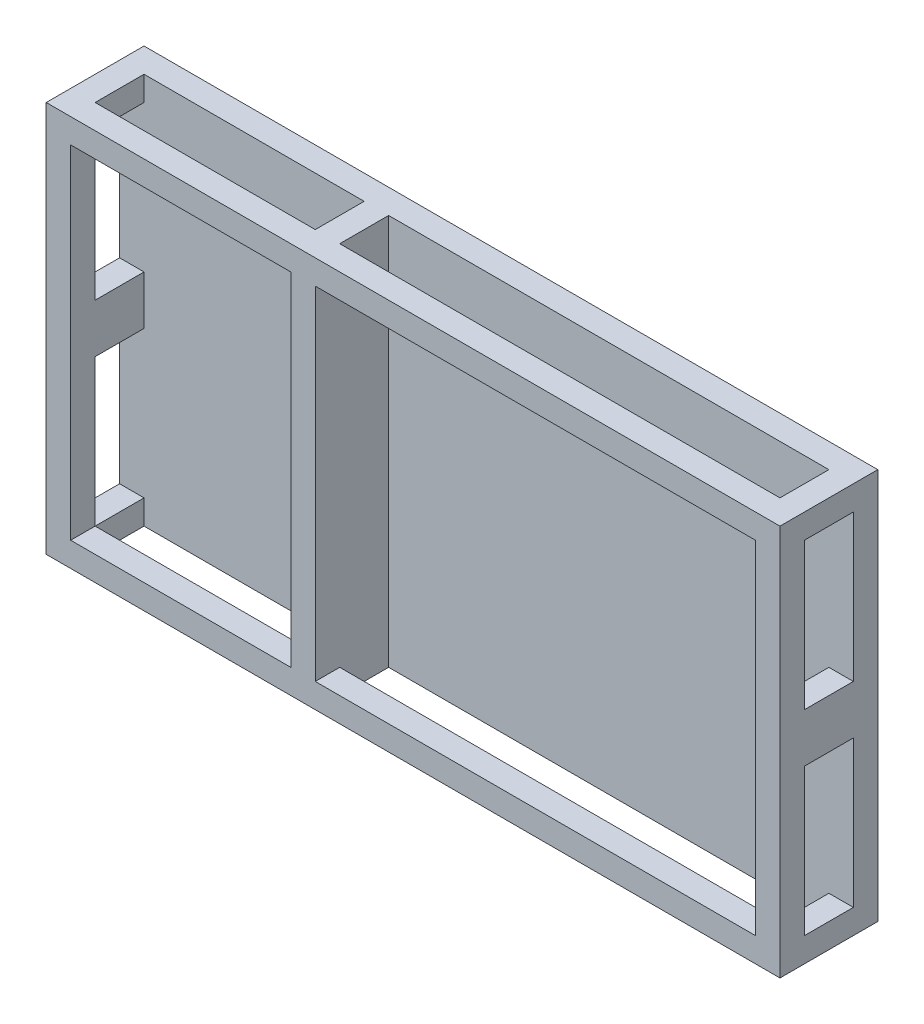
ISO-10303-21;
HEADER;
FILE_DESCRIPTION(('STEP AP214'),'2;1');
FILE_NAME('part.step','',(''),(''),'','','');
FILE_SCHEMA(('AUTOMOTIVE_DESIGN { 1 0 10303 214 1 1 1 1 }'));
ENDSEC;
DATA;
#1=APPLICATION_CONTEXT('core data for automotive mechanical design processes');
#2=APPLICATION_PROTOCOL_DEFINITION('international standard','automotive_design',2000,#1);
#3=PRODUCT_CONTEXT('',#1,'mechanical');
#4=PRODUCT('Part','Part','',(#3));
#5=PRODUCT_RELATED_PRODUCT_CATEGORY('part','',(#4));
#6=PRODUCT_DEFINITION_FORMATION('','',#4);
#7=PRODUCT_DEFINITION_CONTEXT('part definition',#1,'design');
#8=PRODUCT_DEFINITION('design','',#6,#7);
#9=PRODUCT_DEFINITION_SHAPE('','',#8);
#10=(LENGTH_UNIT() NAMED_UNIT(*) SI_UNIT(.MILLI.,.METRE.));
#11=(NAMED_UNIT(*) PLANE_ANGLE_UNIT() SI_UNIT($,.RADIAN.));
#12=(NAMED_UNIT(*) SI_UNIT($,.STERADIAN.) SOLID_ANGLE_UNIT());
#13=UNCERTAINTY_MEASURE_WITH_UNIT(LENGTH_MEASURE(1.E-05),#10,'distance_accuracy_value','');
#14=(GEOMETRIC_REPRESENTATION_CONTEXT(3) GLOBAL_UNCERTAINTY_ASSIGNED_CONTEXT((#13)) GLOBAL_UNIT_ASSIGNED_CONTEXT((#10,
#11,#12)) REPRESENTATION_CONTEXT('',''));
#15=CARTESIAN_POINT('',(0.,0.,0.));
#16=DIRECTION('',(0.,0.,1.));
#17=DIRECTION('',(1.,0.,0.));
#18=AXIS2_PLACEMENT_3D('',#15,#16,#17);
#19=CARTESIAN_POINT('',(5.,0.,15.));
#20=DIRECTION('',(0.,0.,1.));
#21=DIRECTION('',(1.,0.,0.));
#22=AXIS2_PLACEMENT_3D('',#19,#20,#21);
#23=PLANE('',#22);
#24=DIRECTION('',(0.,1.,0.));
#25=VECTOR('',#24,1.);
#26=CARTESIAN_POINT('',(150.,75.,15.));
#27=LINE('',#26,#25);
#28=CARTESIAN_POINT('',(150.,45.,15.));
#29=VERTEX_POINT('',#28);
#30=CARTESIAN_POINT('',(150.,75.,15.));
#31=VERTEX_POINT('',#30);
#32=EDGE_CURVE('E280',#29,#31,#27,.T.);
#33=ORIENTED_EDGE('',*,*,#32,.F.);
#34=DIRECTION('',(-1.,0.,0.));
#35=VECTOR('',#34,1.);
#36=CARTESIAN_POINT('',(5.,45.,15.));
#37=LINE('',#36,#35);
#38=CARTESIAN_POINT('',(145.,45.,15.));
#39=VERTEX_POINT('',#38);
#40=EDGE_CURVE('E640',#29,#39,#37,.T.);
#41=ORIENTED_EDGE('',*,*,#40,.T.);
#42=DIRECTION('',(0.,1.,0.));
#43=VECTOR('',#42,1.);
#44=CARTESIAN_POINT('',(145.,0.,15.));
#45=LINE('',#44,#43);
#46=CARTESIAN_POINT('',(145.,75.,15.));
#47=VERTEX_POINT('',#46);
#48=EDGE_CURVE('E469',#39,#47,#45,.T.);
#49=ORIENTED_EDGE('',*,*,#48,.T.);
#50=DIRECTION('',(-1.,0.,0.));
#51=VECTOR('',#50,1.);
#52=CARTESIAN_POINT('',(150.,75.,15.));
#53=LINE('',#52,#51);
#54=EDGE_CURVE('E306',#31,#47,#53,.T.);
#55=ORIENTED_EDGE('',*,*,#54,.F.);
#56=EDGE_LOOP('',(#33,#41,#49,#55));
#57=FACE_BOUND('',#56,.T.);
#58=ADVANCED_FACE('F37',(#57),#23,.F.);
#59=DIRECTION('',(0.,-1.,0.));
#60=VECTOR('',#59,1.);
#61=CARTESIAN_POINT('',(5.,0.,15.));
#62=LINE('',#61,#60);
#63=CARTESIAN_POINT('',(5.,75.,15.));
#64=VERTEX_POINT('',#63);
#65=CARTESIAN_POINT('',(4.99999999999999,45.,15.));
#66=VERTEX_POINT('',#65);
#67=EDGE_CURVE('E467',#64,#66,#62,.T.);
#68=ORIENTED_EDGE('',*,*,#67,.T.);
#69=DIRECTION('',(-1.,0.,0.));
#70=VECTOR('',#69,1.);
#71=CARTESIAN_POINT('',(5.,45.,15.));
#72=LINE('',#71,#70);
#73=CARTESIAN_POINT('',(0.,45.,15.));
#74=VERTEX_POINT('',#73);
#75=EDGE_CURVE('E622',#66,#74,#72,.T.);
#76=ORIENTED_EDGE('',*,*,#75,.T.);
#77=DIRECTION('',(0.,1.,0.));
#78=VECTOR('',#77,1.);
#79=CARTESIAN_POINT('',(0.,75.,15.));
#80=LINE('',#79,#78);
#81=CARTESIAN_POINT('',(0.,75.,15.));
#82=VERTEX_POINT('',#81);
#83=EDGE_CURVE('E294',#74,#82,#80,.T.);
#84=ORIENTED_EDGE('',*,*,#83,.T.);
#85=EDGE_CURVE('E309',#64,#82,#53,.T.);
#86=ORIENTED_EDGE('',*,*,#85,.F.);
#87=EDGE_LOOP('',(#68,#76,#84,#86));
#88=FACE_BOUND('',#87,.T.);
#89=ADVANCED_FACE('F559',(#88),#23,.F.);
#90=DIRECTION('',(1.,0.,0.));
#91=VECTOR('',#90,1.);
#92=CARTESIAN_POINT('',(5.,80.,15.));
#93=LINE('',#92,#91);
#94=CARTESIAN_POINT('',(5.,80.,15.));
#95=VERTEX_POINT('',#94);
#96=CARTESIAN_POINT('',(50.,80.,15.));
#97=VERTEX_POINT('',#96);
#98=EDGE_CURVE('E346',#95,#97,#93,.T.);
#99=ORIENTED_EDGE('',*,*,#98,.T.);
#100=DIRECTION('',(0.,-1.,0.));
#101=VECTOR('',#100,1.);
#102=CARTESIAN_POINT('',(50.,0.,15.));
#103=LINE('',#102,#101);
#104=CARTESIAN_POINT('',(50.,75.,15.));
#105=VERTEX_POINT('',#104);
#106=EDGE_CURVE('E422',#97,#105,#103,.T.);
#107=ORIENTED_EDGE('',*,*,#106,.T.);
#108=DIRECTION('',(-1.,0.,0.));
#109=VECTOR('',#108,1.);
#110=CARTESIAN_POINT('',(5.,75.,15.));
#111=LINE('',#110,#109);
#112=EDGE_CURVE('E401',#105,#64,#111,.T.);
#113=ORIENTED_EDGE('',*,*,#112,.T.);
#114=DIRECTION('',(0.,1.,0.));
#115=VECTOR('',#114,1.);
#116=CARTESIAN_POINT('',(5.,0.,15.));
#117=LINE('',#116,#115);
#118=EDGE_CURVE('E342',#64,#95,#117,.T.);
#119=ORIENTED_EDGE('',*,*,#118,.T.);
#120=EDGE_LOOP('',(#99,#107,#113,#119));
#121=FACE_BOUND('',#120,.T.);
#122=ADVANCED_FACE('F565',(#121),#23,.F.);
#123=DIRECTION('',(1.,0.,0.));
#124=VECTOR('',#123,1.);
#125=CARTESIAN_POINT('',(5.,4.99999999999999,15.));
#126=LINE('',#125,#124);
#127=CARTESIAN_POINT('',(5.,4.99999999999999,15.));
#128=VERTEX_POINT('',#127);
#129=CARTESIAN_POINT('',(50.,4.99999999999999,15.));
#130=VERTEX_POINT('',#129);
#131=EDGE_CURVE('E45',#128,#130,#126,.T.);
#132=ORIENTED_EDGE('',*,*,#131,.T.);
#133=CARTESIAN_POINT('',(50.,0.,15.));
#134=VERTEX_POINT('',#133);
#135=EDGE_CURVE('E409',#130,#134,#103,.T.);
#136=ORIENTED_EDGE('',*,*,#135,.T.);
#137=DIRECTION('',(1.,0.,0.));
#138=VECTOR('',#137,1.);
#139=CARTESIAN_POINT('',(5.,0.,15.));
#140=LINE('',#139,#138);
#141=CARTESIAN_POINT('',(5.,0.,15.));
#142=VERTEX_POINT('',#141);
#143=EDGE_CURVE('E332',#142,#134,#140,.T.);
#144=ORIENTED_EDGE('',*,*,#143,.F.);
#145=EDGE_CURVE('E366',#142,#128,#117,.T.);
#146=ORIENTED_EDGE('',*,*,#145,.T.);
#147=EDGE_LOOP('',(#132,#136,#144,#146));
#148=FACE_BOUND('',#147,.T.);
#149=ADVANCED_FACE('F407',(#148),#23,.F.);
#150=CARTESIAN_POINT('',(55.002119461006,0.,15.));
#151=VERTEX_POINT('',#150);
#152=CARTESIAN_POINT('',(145.,0.,15.));
#153=VERTEX_POINT('',#152);
#154=EDGE_CURVE('E330',#151,#153,#140,.T.);
#155=ORIENTED_EDGE('',*,*,#154,.F.);
#156=DIRECTION('',(0.,1.,0.));
#157=VECTOR('',#156,1.);
#158=CARTESIAN_POINT('',(55.002119461006,0.,15.));
#159=LINE('',#158,#157);
#160=CARTESIAN_POINT('',(55.002119461006,4.99999999999999,15.));
#161=VERTEX_POINT('',#160);
#162=EDGE_CURVE('E434',#151,#161,#159,.T.);
#163=ORIENTED_EDGE('',*,*,#162,.T.);
#164=DIRECTION('',(1.,0.,0.));
#165=VECTOR('',#164,1.);
#166=CARTESIAN_POINT('',(5.,4.99999999999999,15.));
#167=LINE('',#166,#165);
#168=CARTESIAN_POINT('',(145.,4.99999999999999,15.));
#169=VERTEX_POINT('',#168);
#170=EDGE_CURVE('E399',#161,#169,#167,.T.);
#171=ORIENTED_EDGE('',*,*,#170,.T.);
#172=DIRECTION('',(0.,1.,0.));
#173=VECTOR('',#172,1.);
#174=CARTESIAN_POINT('',(145.,0.,15.));
#175=LINE('',#174,#173);
#176=EDGE_CURVE('E362',#153,#169,#175,.T.);
#177=ORIENTED_EDGE('',*,*,#176,.F.);
#178=EDGE_LOOP('',(#155,#163,#171,#177));
#179=FACE_BOUND('',#178,.T.);
#180=ADVANCED_FACE('F485',(#179),#23,.F.);
#181=CARTESIAN_POINT('',(5.,0.,5.));
#182=DIRECTION('',(0.,0.,-1.));
#183=DIRECTION('',(-1.,0.,0.));
#184=AXIS2_PLACEMENT_3D('',#181,#182,#183);
#185=PLANE('',#184);
#186=DIRECTION('',(0.,-1.,0.));
#187=VECTOR('',#186,1.);
#188=CARTESIAN_POINT('',(0.,75.,5.));
#189=LINE('',#188,#187);
#190=CARTESIAN_POINT('',(0.,75.,5.));
#191=VERTEX_POINT('',#190);
#192=CARTESIAN_POINT('',(0.,45.,5.));
#193=VERTEX_POINT('',#192);
#194=EDGE_CURVE('E288',#191,#193,#189,.T.);
#195=ORIENTED_EDGE('',*,*,#194,.T.);
#196=DIRECTION('',(1.,0.,0.));
#197=VECTOR('',#196,1.);
#198=CARTESIAN_POINT('',(5.,45.,5.));
#199=LINE('',#198,#197);
#200=CARTESIAN_POINT('',(5.,45.,5.));
#201=VERTEX_POINT('',#200);
#202=EDGE_CURVE('E625',#193,#201,#199,.T.);
#203=ORIENTED_EDGE('',*,*,#202,.T.);
#204=DIRECTION('',(0.,1.,0.));
#205=VECTOR('',#204,1.);
#206=CARTESIAN_POINT('',(5.,0.,5.));
#207=LINE('',#206,#205);
#208=CARTESIAN_POINT('',(5.,35.,5.));
#209=VERTEX_POINT('',#208);
#210=EDGE_CURVE('E517',#209,#201,#207,.T.);
#211=ORIENTED_EDGE('',*,*,#210,.F.);
#212=DIRECTION('',(-1.,0.,0.));
#213=VECTOR('',#212,1.);
#214=CARTESIAN_POINT('',(5.,35.,5.));
#215=LINE('',#214,#213);
#216=CARTESIAN_POINT('',(0.,35.,5.));
#217=VERTEX_POINT('',#216);
#218=EDGE_CURVE('E607',#209,#217,#215,.T.);
#219=ORIENTED_EDGE('',*,*,#218,.T.);
#220=CARTESIAN_POINT('',(0.,4.99999999999999,5.00000000000001));
#221=VERTEX_POINT('',#220);
#222=EDGE_CURVE('E291',#217,#221,#189,.T.);
#223=ORIENTED_EDGE('',*,*,#222,.T.);
#224=DIRECTION('',(-1.,0.,0.));
#225=VECTOR('',#224,1.);
#226=CARTESIAN_POINT('',(150.,4.99999999999999,5.00000000000001));
#227=LINE('',#226,#225);
#228=CARTESIAN_POINT('',(5.,4.99999999999999,5.00000000000001));
#229=VERTEX_POINT('',#228);
#230=EDGE_CURVE('E283',#229,#221,#227,.T.);
#231=ORIENTED_EDGE('',*,*,#230,.F.);
#232=DIRECTION('',(0.,1.,0.));
#233=VECTOR('',#232,1.);
#234=CARTESIAN_POINT('',(5.,0.,5.));
#235=LINE('',#234,#233);
#236=CARTESIAN_POINT('',(5.,0.,5.));
#237=VERTEX_POINT('',#236);
#238=EDGE_CURVE('E353',#237,#229,#235,.T.);
#239=ORIENTED_EDGE('',*,*,#238,.F.);
#240=DIRECTION('',(-1.,0.,0.));
#241=VECTOR('',#240,1.);
#242=CARTESIAN_POINT('',(5.,0.,5.));
#243=LINE('',#242,#241);
#244=CARTESIAN_POINT('',(50.,0.,5.));
#245=VERTEX_POINT('',#244);
#246=EDGE_CURVE('E338',#245,#237,#243,.T.);
#247=ORIENTED_EDGE('',*,*,#246,.F.);
#248=DIRECTION('',(0.,1.,0.));
#249=VECTOR('',#248,1.);
#250=CARTESIAN_POINT('',(50.,0.,5.));
#251=LINE('',#250,#249);
#252=CARTESIAN_POINT('',(50.,80.,5.));
#253=VERTEX_POINT('',#252);
#254=EDGE_CURVE('E423',#245,#253,#251,.T.);
#255=ORIENTED_EDGE('',*,*,#254,.T.);
#256=DIRECTION('',(-1.,0.,0.));
#257=VECTOR('',#256,1.);
#258=CARTESIAN_POINT('',(5.,80.,5.));
#259=LINE('',#258,#257);
#260=CARTESIAN_POINT('',(5.,80.,5.));
#261=VERTEX_POINT('',#260);
#262=EDGE_CURVE('E351',#253,#261,#259,.T.);
#263=ORIENTED_EDGE('',*,*,#262,.T.);
#264=CARTESIAN_POINT('',(5.,75.,5.));
#265=VERTEX_POINT('',#264);
#266=EDGE_CURVE('E357',#265,#261,#235,.T.);
#267=ORIENTED_EDGE('',*,*,#266,.F.);
#268=DIRECTION('',(-1.,0.,0.));
#269=VECTOR('',#268,1.);
#270=CARTESIAN_POINT('',(150.,75.,5.));
#271=LINE('',#270,#269);
#272=EDGE_CURVE('E305',#265,#191,#271,.T.);
#273=ORIENTED_EDGE('',*,*,#272,.T.);
#274=EDGE_LOOP('',(#195,#203,#211,#219,#223,#231,#239,#247,#255,#263,#267,#273));
#275=FACE_BOUND('',#274,.T.);
#276=ADVANCED_FACE('F590',(#275),#185,.F.);
#277=DIRECTION('',(-1.,0.,0.));
#278=VECTOR('',#277,1.);
#279=CARTESIAN_POINT('',(5.,75.,15.));
#280=LINE('',#279,#278);
#281=CARTESIAN_POINT('',(55.002119461006,75.,15.));
#282=VERTEX_POINT('',#281);
#283=EDGE_CURVE('E396',#47,#282,#280,.T.);
#284=ORIENTED_EDGE('',*,*,#283,.T.);
#285=CARTESIAN_POINT('',(55.002119461006,80.,15.));
#286=VERTEX_POINT('',#285);
#287=EDGE_CURVE('E425',#282,#286,#159,.T.);
#288=ORIENTED_EDGE('',*,*,#287,.T.);
#289=CARTESIAN_POINT('',(145.,80.,15.));
#290=VERTEX_POINT('',#289);
#291=EDGE_CURVE('E345',#286,#290,#93,.T.);
#292=ORIENTED_EDGE('',*,*,#291,.T.);
#293=EDGE_CURVE('E365',#47,#290,#175,.T.);
#294=ORIENTED_EDGE('',*,*,#293,.F.);
#295=EDGE_LOOP('',(#284,#288,#292,#294));
#296=FACE_BOUND('',#295,.T.);
#297=ADVANCED_FACE('F582',(#296),#23,.F.);
#298=CARTESIAN_POINT('',(0.,4.99999999999999,15.));
#299=VERTEX_POINT('',#298);
#300=CARTESIAN_POINT('',(0.,35.,15.));
#301=VERTEX_POINT('',#300);
#302=EDGE_CURVE('E295',#299,#301,#80,.T.);
#303=ORIENTED_EDGE('',*,*,#302,.T.);
#304=DIRECTION('',(1.,0.,0.));
#305=VECTOR('',#304,1.);
#306=CARTESIAN_POINT('',(5.,35.,15.));
#307=LINE('',#306,#305);
#308=CARTESIAN_POINT('',(5.,35.,15.));
#309=VERTEX_POINT('',#308);
#310=EDGE_CURVE('E594',#301,#309,#307,.T.);
#311=ORIENTED_EDGE('',*,*,#310,.T.);
#312=EDGE_CURVE('E456',#309,#128,#62,.T.);
#313=ORIENTED_EDGE('',*,*,#312,.T.);
#314=DIRECTION('',(-1.,0.,0.));
#315=VECTOR('',#314,1.);
#316=CARTESIAN_POINT('',(150.,4.99999999999999,15.));
#317=LINE('',#316,#315);
#318=EDGE_CURVE('E312',#128,#299,#317,.T.);
#319=ORIENTED_EDGE('',*,*,#318,.T.);
#320=EDGE_LOOP('',(#303,#311,#313,#319));
#321=FACE_BOUND('',#320,.T.);
#322=ADVANCED_FACE('F571',(#321),#23,.F.);
#323=CARTESIAN_POINT('',(5.,0.,5.));
#324=DIRECTION('',(-1.,0.,0.));
#325=DIRECTION('',(0.,0.,1.));
#326=AXIS2_PLACEMENT_3D('',#323,#324,#325);
#327=PLANE('',#326);
#328=ORIENTED_EDGE('',*,*,#118,.F.);
#329=DIRECTION('',(0.,0.,-1.));
#330=VECTOR('',#329,1.);
#331=CARTESIAN_POINT('',(5.,75.,5.));
#332=LINE('',#331,#330);
#333=EDGE_CURVE('E323',#64,#265,#332,.T.);
#334=ORIENTED_EDGE('',*,*,#333,.T.);
#335=ORIENTED_EDGE('',*,*,#266,.T.);
#336=DIRECTION('',(0.,0.,1.));
#337=VECTOR('',#336,1.);
#338=CARTESIAN_POINT('',(5.,80.,5.));
#339=LINE('',#338,#337);
#340=EDGE_CURVE('E326',#261,#95,#339,.T.);
#341=ORIENTED_EDGE('',*,*,#340,.T.);
#342=EDGE_LOOP('',(#328,#334,#335,#341));
#343=FACE_BOUND('',#342,.T.);
#344=ADVANCED_FACE('F581',(#343),#327,.F.);
#345=CARTESIAN_POINT('',(145.,0.,5.));
#346=DIRECTION('',(1.,0.,0.));
#347=DIRECTION('',(0.,0.,-1.));
#348=AXIS2_PLACEMENT_3D('',#345,#346,#347);
#349=PLANE('',#348);
#350=DIRECTION('',(0.,1.,0.));
#351=VECTOR('',#350,1.);
#352=CARTESIAN_POINT('',(145.,0.,5.));
#353=LINE('',#352,#351);
#354=CARTESIAN_POINT('',(145.,75.,5.));
#355=VERTEX_POINT('',#354);
#356=CARTESIAN_POINT('',(145.,80.,5.));
#357=VERTEX_POINT('',#356);
#358=EDGE_CURVE('E361',#355,#357,#353,.T.);
#359=ORIENTED_EDGE('',*,*,#358,.F.);
#360=DIRECTION('',(0.,0.,1.));
#361=VECTOR('',#360,1.);
#362=CARTESIAN_POINT('',(145.,75.,5.));
#363=LINE('',#362,#361);
#364=EDGE_CURVE('E320',#355,#47,#363,.T.);
#365=ORIENTED_EDGE('',*,*,#364,.T.);
#366=ORIENTED_EDGE('',*,*,#293,.T.);
#367=DIRECTION('',(0.,0.,-1.));
#368=VECTOR('',#367,1.);
#369=CARTESIAN_POINT('',(145.,80.,5.));
#370=LINE('',#369,#368);
#371=EDGE_CURVE('E348',#290,#357,#370,.T.);
#372=ORIENTED_EDGE('',*,*,#371,.T.);
#373=EDGE_LOOP('',(#359,#365,#366,#372));
#374=FACE_BOUND('',#373,.T.);
#375=ADVANCED_FACE('F579',(#374),#349,.F.);
#376=CARTESIAN_POINT('',(0.,0.,20.));
#377=DIRECTION('',(1.,0.,0.));
#378=DIRECTION('',(0.,0.,-1.));
#379=AXIS2_PLACEMENT_3D('',#376,#377,#378);
#380=PLANE('',#379);
#381=DIRECTION('',(0.,0.,-1.));
#382=VECTOR('',#381,1.);
#383=CARTESIAN_POINT('',(0.,45.,0.));
#384=LINE('',#383,#382);
#385=EDGE_CURVE('E611',#74,#193,#384,.T.);
#386=ORIENTED_EDGE('',*,*,#385,.T.);
#387=ORIENTED_EDGE('',*,*,#194,.F.);
#388=DIRECTION('',(0.,0.,-1.));
#389=VECTOR('',#388,1.);
#390=CARTESIAN_POINT('',(0.,75.,5.));
#391=LINE('',#390,#389);
#392=EDGE_CURVE('E297',#82,#191,#391,.T.);
#393=ORIENTED_EDGE('',*,*,#392,.F.);
#394=ORIENTED_EDGE('',*,*,#83,.F.);
#395=EDGE_LOOP('',(#386,#387,#393,#394));
#396=FACE_BOUND('',#395,.T.);
#397=ORIENTED_EDGE('',*,*,#222,.F.);
#398=DIRECTION('',(0.,0.,1.));
#399=VECTOR('',#398,1.);
#400=CARTESIAN_POINT('',(0.,35.,0.));
#401=LINE('',#400,#399);
#402=EDGE_CURVE('E604',#217,#301,#401,.T.);
#403=ORIENTED_EDGE('',*,*,#402,.T.);
#404=ORIENTED_EDGE('',*,*,#302,.F.);
#405=DIRECTION('',(0.,0.,1.));
#406=VECTOR('',#405,1.);
#407=CARTESIAN_POINT('',(0.,4.99999999999999,5.00000000000001));
#408=LINE('',#407,#406);
#409=EDGE_CURVE('E290',#221,#299,#408,.T.);
#410=ORIENTED_EDGE('',*,*,#409,.F.);
#411=EDGE_LOOP('',(#397,#403,#404,#410));
#412=FACE_BOUND('',#411,.T.);
#413=DIRECTION('',(0.,0.,-1.));
#414=VECTOR('',#413,1.);
#415=CARTESIAN_POINT('',(0.,0.,20.));
#416=LINE('',#415,#414);
#417=CARTESIAN_POINT('',(0.,0.,20.));
#418=VERTEX_POINT('',#417);
#419=CARTESIAN_POINT('',(0.,0.,0.));
#420=VERTEX_POINT('',#419);
#421=EDGE_CURVE('E393',#418,#420,#416,.T.);
#422=ORIENTED_EDGE('',*,*,#421,.F.);
#423=DIRECTION('',(0.,-1.,0.));
#424=VECTOR('',#423,1.);
#425=CARTESIAN_POINT('',(0.,0.,20.));
#426=LINE('',#425,#424);
#427=CARTESIAN_POINT('',(0.,80.,20.));
#428=VERTEX_POINT('',#427);
#429=EDGE_CURVE('E369',#428,#418,#426,.T.);
#430=ORIENTED_EDGE('',*,*,#429,.F.);
#431=DIRECTION('',(0.,0.,-1.));
#432=VECTOR('',#431,1.);
#433=CARTESIAN_POINT('',(0.,80.,20.));
#434=LINE('',#433,#432);
#435=CARTESIAN_POINT('',(0.,80.,0.));
#436=VERTEX_POINT('',#435);
#437=EDGE_CURVE('E378',#428,#436,#434,.T.);
#438=ORIENTED_EDGE('',*,*,#437,.T.);
#439=DIRECTION('',(0.,-1.,0.));
#440=VECTOR('',#439,1.);
#441=CARTESIAN_POINT('',(0.,0.,0.));
#442=LINE('',#441,#440);
#443=EDGE_CURVE('E356',#436,#420,#442,.T.);
#444=ORIENTED_EDGE('',*,*,#443,.T.);
#445=EDGE_LOOP('',(#422,#430,#438,#444));
#446=FACE_BOUND('',#445,.T.);
#447=ADVANCED_FACE('F39',(#396,#412,#446),#380,.F.);
#448=CARTESIAN_POINT('',(0.,0.,20.));
#449=DIRECTION('',(0.,1.,0.));
#450=DIRECTION('',(0.,0.,1.));
#451=AXIS2_PLACEMENT_3D('',#448,#449,#450);
#452=PLANE('',#451);
#453=DIRECTION('',(0.,0.,-1.));
#454=VECTOR('',#453,1.);
#455=CARTESIAN_POINT('',(55.002119461006,0.,20.));
#456=LINE('',#455,#454);
#457=CARTESIAN_POINT('',(55.002119461006,0.,5.));
#458=VERTEX_POINT('',#457);
#459=EDGE_CURVE('E507',#151,#458,#456,.T.);
#460=ORIENTED_EDGE('',*,*,#459,.F.);
#461=ORIENTED_EDGE('',*,*,#154,.T.);
#462=DIRECTION('',(0.,0.,-1.));
#463=VECTOR('',#462,1.);
#464=CARTESIAN_POINT('',(145.,0.,5.));
#465=LINE('',#464,#463);
#466=CARTESIAN_POINT('',(145.,0.,5.));
#467=VERTEX_POINT('',#466);
#468=EDGE_CURVE('E335',#153,#467,#465,.T.);
#469=ORIENTED_EDGE('',*,*,#468,.T.);
#470=EDGE_CURVE('E339',#467,#458,#243,.T.);
#471=ORIENTED_EDGE('',*,*,#470,.T.);
#472=EDGE_LOOP('',(#460,#461,#469,#471));
#473=FACE_BOUND('',#472,.T.);
#474=DIRECTION('',(0.,0.,1.));
#475=VECTOR('',#474,1.);
#476=CARTESIAN_POINT('',(50.,0.,20.));
#477=LINE('',#476,#475);
#478=EDGE_CURVE('E421',#245,#134,#477,.T.);
#479=ORIENTED_EDGE('',*,*,#478,.F.);
#480=ORIENTED_EDGE('',*,*,#246,.T.);
#481=DIRECTION('',(0.,0.,1.));
#482=VECTOR('',#481,1.);
#483=CARTESIAN_POINT('',(5.,0.,5.));
#484=LINE('',#483,#482);
#485=EDGE_CURVE('E327',#237,#142,#484,.T.);
#486=ORIENTED_EDGE('',*,*,#485,.T.);
#487=ORIENTED_EDGE('',*,*,#143,.T.);
#488=EDGE_LOOP('',(#479,#480,#486,#487));
#489=FACE_BOUND('',#488,.T.);
#490=DIRECTION('',(0.,0.,-1.));
#491=VECTOR('',#490,1.);
#492=CARTESIAN_POINT('',(150.,0.,20.));
#493=LINE('',#492,#491);
#494=CARTESIAN_POINT('',(150.,0.,20.));
#495=VERTEX_POINT('',#494);
#496=CARTESIAN_POINT('',(150.,0.,0.));
#497=VERTEX_POINT('',#496);
#498=EDGE_CURVE('E390',#495,#497,#493,.T.);
#499=ORIENTED_EDGE('',*,*,#498,.F.);
#500=DIRECTION('',(1.,0.,0.));
#501=VECTOR('',#500,1.);
#502=CARTESIAN_POINT('',(0.,0.,20.));
#503=LINE('',#502,#501);
#504=EDGE_CURVE('E371',#418,#495,#503,.T.);
#505=ORIENTED_EDGE('',*,*,#504,.F.);
#506=ORIENTED_EDGE('',*,*,#421,.T.);
#507=DIRECTION('',(1.,0.,0.));
#508=VECTOR('',#507,1.);
#509=CARTESIAN_POINT('',(0.,0.,0.));
#510=LINE('',#509,#508);
#511=EDGE_CURVE('E380',#420,#497,#510,.T.);
#512=ORIENTED_EDGE('',*,*,#511,.T.);
#513=EDGE_LOOP('',(#499,#505,#506,#512));
#514=FACE_BOUND('',#513,.T.);
#515=ADVANCED_FACE('F527',(#473,#489,#514),#452,.F.);
#516=CARTESIAN_POINT('',(150.,0.,20.));
#517=DIRECTION('',(-1.,0.,0.));
#518=DIRECTION('',(0.,0.,1.));
#519=AXIS2_PLACEMENT_3D('',#516,#517,#518);
#520=PLANE('',#519);
#521=DIRECTION('',(0.,0.,1.));
#522=VECTOR('',#521,1.);
#523=CARTESIAN_POINT('',(150.,45.,20.));
#524=LINE('',#523,#522);
#525=CARTESIAN_POINT('',(150.,45.,5.));
#526=VERTEX_POINT('',#525);
#527=EDGE_CURVE('E60',#526,#29,#524,.T.);
#528=ORIENTED_EDGE('',*,*,#527,.T.);
#529=ORIENTED_EDGE('',*,*,#32,.T.);
#530=DIRECTION('',(0.,0.,-1.));
#531=VECTOR('',#530,1.);
#532=CARTESIAN_POINT('',(150.,75.,5.));
#533=LINE('',#532,#531);
#534=CARTESIAN_POINT('',(150.,75.,5.));
#535=VERTEX_POINT('',#534);
#536=EDGE_CURVE('E279',#31,#535,#533,.T.);
#537=ORIENTED_EDGE('',*,*,#536,.T.);
#538=DIRECTION('',(0.,-1.,0.));
#539=VECTOR('',#538,1.);
#540=CARTESIAN_POINT('',(150.,75.,5.));
#541=LINE('',#540,#539);
#542=EDGE_CURVE('E470',#535,#526,#541,.T.);
#543=ORIENTED_EDGE('',*,*,#542,.T.);
#544=EDGE_LOOP('',(#528,#529,#537,#543));
#545=FACE_BOUND('',#544,.T.);
#546=DIRECTION('',(0.,0.,-1.));
#547=VECTOR('',#546,1.);
#548=CARTESIAN_POINT('',(150.,35.,20.));
#549=LINE('',#548,#547);
#550=CARTESIAN_POINT('',(150.,35.,15.));
#551=VERTEX_POINT('',#550);
#552=CARTESIAN_POINT('',(150.,35.,5.));
#553=VERTEX_POINT('',#552);
#554=EDGE_CURVE('E52',#551,#553,#549,.T.);
#555=ORIENTED_EDGE('',*,*,#554,.T.);
#556=CARTESIAN_POINT('',(150.,4.99999999999999,5.00000000000001));
#557=VERTEX_POINT('',#556);
#558=EDGE_CURVE('E300',#553,#557,#541,.T.);
#559=ORIENTED_EDGE('',*,*,#558,.T.);
#560=DIRECTION('',(0.,0.,1.));
#561=VECTOR('',#560,1.);
#562=CARTESIAN_POINT('',(150.,4.99999999999999,5.00000000000001));
#563=LINE('',#562,#561);
#564=CARTESIAN_POINT('',(150.,4.99999999999999,15.));
#565=VERTEX_POINT('',#564);
#566=EDGE_CURVE('E278',#557,#565,#563,.T.);
#567=ORIENTED_EDGE('',*,*,#566,.T.);
#568=EDGE_CURVE('E268',#565,#551,#27,.T.);
#569=ORIENTED_EDGE('',*,*,#568,.T.);
#570=EDGE_LOOP('',(#555,#559,#567,#569));
#571=FACE_BOUND('',#570,.T.);
#572=DIRECTION('',(0.,1.,0.));
#573=VECTOR('',#572,1.);
#574=CARTESIAN_POINT('',(150.,0.,0.));
#575=LINE('',#574,#573);
#576=CARTESIAN_POINT('',(150.,80.,0.));
#577=VERTEX_POINT('',#576);
#578=EDGE_CURVE('E382',#497,#577,#575,.T.);
#579=ORIENTED_EDGE('',*,*,#578,.T.);
#580=DIRECTION('',(0.,0.,-1.));
#581=VECTOR('',#580,1.);
#582=CARTESIAN_POINT('',(150.,80.,20.));
#583=LINE('',#582,#581);
#584=CARTESIAN_POINT('',(150.,80.,20.));
#585=VERTEX_POINT('',#584);
#586=EDGE_CURVE('E387',#585,#577,#583,.T.);
#587=ORIENTED_EDGE('',*,*,#586,.F.);
#588=DIRECTION('',(0.,1.,0.));
#589=VECTOR('',#588,1.);
#590=CARTESIAN_POINT('',(150.,0.,20.));
#591=LINE('',#590,#589);
#592=EDGE_CURVE('E374',#495,#585,#591,.T.);
#593=ORIENTED_EDGE('',*,*,#592,.F.);
#594=ORIENTED_EDGE('',*,*,#498,.T.);
#595=EDGE_LOOP('',(#579,#587,#593,#594));
#596=FACE_BOUND('',#595,.T.);
#597=ADVANCED_FACE('F275',(#545,#571,#596),#520,.F.);
#598=CARTESIAN_POINT('',(0.,80.,20.));
#599=DIRECTION('',(0.,-1.,0.));
#600=DIRECTION('',(0.,0.,-1.));
#601=AXIS2_PLACEMENT_3D('',#598,#599,#600);
#602=PLANE('',#601);
#603=ORIENTED_EDGE('',*,*,#291,.F.);
#604=DIRECTION('',(0.,0.,-1.));
#605=VECTOR('',#604,1.);
#606=CARTESIAN_POINT('',(55.002119461006,80.,20.));
#607=LINE('',#606,#605);
#608=CARTESIAN_POINT('',(55.002119461006,80.,5.));
#609=VERTEX_POINT('',#608);
#610=EDGE_CURVE('E511',#286,#609,#607,.T.);
#611=ORIENTED_EDGE('',*,*,#610,.T.);
#612=EDGE_CURVE('E331',#357,#609,#259,.T.);
#613=ORIENTED_EDGE('',*,*,#612,.F.);
#614=ORIENTED_EDGE('',*,*,#371,.F.);
#615=EDGE_LOOP('',(#603,#611,#613,#614));
#616=FACE_BOUND('',#615,.T.);
#617=DIRECTION('',(0.,0.,1.));
#618=VECTOR('',#617,1.);
#619=CARTESIAN_POINT('',(50.,80.,20.));
#620=LINE('',#619,#618);
#621=EDGE_CURVE('E515',#253,#97,#620,.T.);
#622=ORIENTED_EDGE('',*,*,#621,.T.);
#623=ORIENTED_EDGE('',*,*,#98,.F.);
#624=ORIENTED_EDGE('',*,*,#340,.F.);
#625=ORIENTED_EDGE('',*,*,#262,.F.);
#626=EDGE_LOOP('',(#622,#623,#624,#625));
#627=FACE_BOUND('',#626,.T.);
#628=DIRECTION('',(-1.,0.,0.));
#629=VECTOR('',#628,1.);
#630=CARTESIAN_POINT('',(0.,80.,0.));
#631=LINE('',#630,#629);
#632=EDGE_CURVE('E372',#577,#436,#631,.T.);
#633=ORIENTED_EDGE('',*,*,#632,.T.);
#634=ORIENTED_EDGE('',*,*,#437,.F.);
#635=DIRECTION('',(-1.,0.,0.));
#636=VECTOR('',#635,1.);
#637=CARTESIAN_POINT('',(0.,80.,20.));
#638=LINE('',#637,#636);
#639=EDGE_CURVE('E376',#585,#428,#638,.T.);
#640=ORIENTED_EDGE('',*,*,#639,.F.);
#641=ORIENTED_EDGE('',*,*,#586,.T.);
#642=EDGE_LOOP('',(#633,#634,#640,#641));
#643=FACE_BOUND('',#642,.T.);
#644=ADVANCED_FACE('F523',(#616,#627,#643),#602,.F.);
#645=CARTESIAN_POINT('',(0.,0.,20.));
#646=DIRECTION('',(0.,0.,-1.));
#647=DIRECTION('',(-1.,0.,0.));
#648=AXIS2_PLACEMENT_3D('',#645,#646,#647);
#649=PLANE('',#648);
#650=ORIENTED_EDGE('',*,*,#592,.T.);
#651=ORIENTED_EDGE('',*,*,#639,.T.);
#652=ORIENTED_EDGE('',*,*,#429,.T.);
#653=ORIENTED_EDGE('',*,*,#504,.T.);
#654=EDGE_LOOP('',(#650,#651,#652,#653));
#655=FACE_BOUND('',#654,.T.);
#656=DIRECTION('',(1.,0.,0.));
#657=VECTOR('',#656,1.);
#658=CARTESIAN_POINT('',(5.00000000000001,4.99999999999999,20.));
#659=LINE('',#658,#657);
#660=CARTESIAN_POINT('',(5.00000000000001,4.99999999999999,20.));
#661=VERTEX_POINT('',#660);
#662=CARTESIAN_POINT('',(50.,4.99999999999999,20.));
#663=VERTEX_POINT('',#662);
#664=EDGE_CURVE('E443',#661,#663,#659,.T.);
#665=ORIENTED_EDGE('',*,*,#664,.F.);
#666=DIRECTION('',(0.,-1.,0.));
#667=VECTOR('',#666,1.);
#668=CARTESIAN_POINT('',(5.,75.,20.));
#669=LINE('',#668,#667);
#670=CARTESIAN_POINT('',(5.,75.,20.));
#671=VERTEX_POINT('',#670);
#672=EDGE_CURVE('E445',#671,#661,#669,.T.);
#673=ORIENTED_EDGE('',*,*,#672,.F.);
#674=DIRECTION('',(-1.,0.,0.));
#675=VECTOR('',#674,1.);
#676=CARTESIAN_POINT('',(5.,75.,20.));
#677=LINE('',#676,#675);
#678=CARTESIAN_POINT('',(50.,75.,20.));
#679=VERTEX_POINT('',#678);
#680=EDGE_CURVE('E439',#679,#671,#677,.T.);
#681=ORIENTED_EDGE('',*,*,#680,.F.);
#682=DIRECTION('',(0.,1.,0.));
#683=VECTOR('',#682,1.);
#684=CARTESIAN_POINT('',(50.,75.,20.));
#685=LINE('',#684,#683);
#686=EDGE_CURVE('E441',#663,#679,#685,.T.);
#687=ORIENTED_EDGE('',*,*,#686,.F.);
#688=EDGE_LOOP('',(#665,#673,#681,#687));
#689=FACE_BOUND('',#688,.T.);
#690=DIRECTION('',(-1.,0.,0.));
#691=VECTOR('',#690,1.);
#692=CARTESIAN_POINT('',(55.,75.,20.));
#693=LINE('',#692,#691);
#694=CARTESIAN_POINT('',(145.,75.,20.));
#695=VERTEX_POINT('',#694);
#696=CARTESIAN_POINT('',(55.002119461006,75.,20.));
#697=VERTEX_POINT('',#696);
#698=EDGE_CURVE('E457',#695,#697,#693,.T.);
#699=ORIENTED_EDGE('',*,*,#698,.F.);
#700=DIRECTION('',(0.,1.,0.));
#701=VECTOR('',#700,1.);
#702=CARTESIAN_POINT('',(145.,75.,20.));
#703=LINE('',#702,#701);
#704=CARTESIAN_POINT('',(145.,4.99999999999999,20.));
#705=VERTEX_POINT('',#704);
#706=EDGE_CURVE('E460',#705,#695,#703,.T.);
#707=ORIENTED_EDGE('',*,*,#706,.F.);
#708=DIRECTION('',(1.,0.,0.));
#709=VECTOR('',#708,1.);
#710=CARTESIAN_POINT('',(55.,4.99999999999999,20.));
#711=LINE('',#710,#709);
#712=CARTESIAN_POINT('',(55.002119461006,4.99999999999999,20.));
#713=VERTEX_POINT('',#712);
#714=EDGE_CURVE('E438',#713,#705,#711,.T.);
#715=ORIENTED_EDGE('',*,*,#714,.F.);
#716=DIRECTION('',(0.,1.,0.));
#717=VECTOR('',#716,1.);
#718=CARTESIAN_POINT('',(55.002119461006,0.,20.));
#719=LINE('',#718,#717);
#720=EDGE_CURVE('E427',#713,#697,#719,.T.);
#721=ORIENTED_EDGE('',*,*,#720,.T.);
#722=EDGE_LOOP('',(#699,#707,#715,#721));
#723=FACE_BOUND('',#722,.T.);
#724=ADVANCED_FACE('F501',(#655,#689,#723),#649,.F.);
#725=CARTESIAN_POINT('',(0.,0.,0.));
#726=DIRECTION('',(0.,0.,-1.));
#727=DIRECTION('',(-1.,0.,0.));
#728=AXIS2_PLACEMENT_3D('',#725,#726,#727);
#729=PLANE('',#728);
#730=ORIENTED_EDGE('',*,*,#632,.F.);
#731=ORIENTED_EDGE('',*,*,#578,.F.);
#732=ORIENTED_EDGE('',*,*,#511,.F.);
#733=ORIENTED_EDGE('',*,*,#443,.F.);
#734=EDGE_LOOP('',(#730,#731,#732,#733));
#735=FACE_BOUND('',#734,.T.);
#736=ADVANCED_FACE('F547',(#735),#729,.T.);
#737=ORIENTED_EDGE('',*,*,#238,.T.);
#738=DIRECTION('',(0.,0.,1.));
#739=VECTOR('',#738,1.);
#740=CARTESIAN_POINT('',(5.,4.99999999999999,5.));
#741=LINE('',#740,#739);
#742=EDGE_CURVE('E317',#229,#128,#741,.T.);
#743=ORIENTED_EDGE('',*,*,#742,.T.);
#744=ORIENTED_EDGE('',*,*,#145,.F.);
#745=ORIENTED_EDGE('',*,*,#485,.F.);
#746=EDGE_LOOP('',(#737,#743,#744,#745));
#747=FACE_BOUND('',#746,.T.);
#748=ADVANCED_FACE('F589',(#747),#327,.F.);
#749=DIRECTION('',(0.,-1.,0.));
#750=VECTOR('',#749,1.);
#751=CARTESIAN_POINT('',(145.,0.,5.));
#752=LINE('',#751,#750);
#753=CARTESIAN_POINT('',(145.,45.,5.));
#754=VERTEX_POINT('',#753);
#755=CARTESIAN_POINT('',(145.,35.,5.));
#756=VERTEX_POINT('',#755);
#757=EDGE_CURVE('E612',#754,#756,#752,.T.);
#758=ORIENTED_EDGE('',*,*,#757,.F.);
#759=DIRECTION('',(1.,0.,0.));
#760=VECTOR('',#759,1.);
#761=CARTESIAN_POINT('',(5.,45.,5.));
#762=LINE('',#761,#760);
#763=EDGE_CURVE('E616',#754,#526,#762,.T.);
#764=ORIENTED_EDGE('',*,*,#763,.T.);
#765=ORIENTED_EDGE('',*,*,#542,.F.);
#766=EDGE_CURVE('E301',#535,#355,#271,.T.);
#767=ORIENTED_EDGE('',*,*,#766,.T.);
#768=ORIENTED_EDGE('',*,*,#358,.T.);
#769=ORIENTED_EDGE('',*,*,#612,.T.);
#770=DIRECTION('',(0.,-1.,0.));
#771=VECTOR('',#770,1.);
#772=CARTESIAN_POINT('',(55.002119461006,0.,5.));
#773=LINE('',#772,#771);
#774=EDGE_CURVE('E436',#609,#458,#773,.T.);
#775=ORIENTED_EDGE('',*,*,#774,.T.);
#776=ORIENTED_EDGE('',*,*,#470,.F.);
#777=CARTESIAN_POINT('',(145.,4.99999999999999,5.));
#778=VERTEX_POINT('',#777);
#779=EDGE_CURVE('E358',#467,#778,#353,.T.);
#780=ORIENTED_EDGE('',*,*,#779,.T.);
#781=EDGE_CURVE('E313',#557,#778,#227,.T.);
#782=ORIENTED_EDGE('',*,*,#781,.F.);
#783=ORIENTED_EDGE('',*,*,#558,.F.);
#784=DIRECTION('',(-1.,0.,0.));
#785=VECTOR('',#784,1.);
#786=CARTESIAN_POINT('',(5.,35.,5.));
#787=LINE('',#786,#785);
#788=EDGE_CURVE('E261',#553,#756,#787,.T.);
#789=ORIENTED_EDGE('',*,*,#788,.T.);
#790=EDGE_LOOP('',(#758,#764,#765,#767,#768,#769,#775,#776,#780,#782,#783,#789));
#791=FACE_BOUND('',#790,.T.);
#792=ADVANCED_FACE('F475',(#791),#185,.F.);
#793=ORIENTED_EDGE('',*,*,#176,.T.);
#794=DIRECTION('',(0.,0.,-1.));
#795=VECTOR('',#794,1.);
#796=CARTESIAN_POINT('',(145.,4.99999999999999,5.));
#797=LINE('',#796,#795);
#798=EDGE_CURVE('E304',#169,#778,#797,.T.);
#799=ORIENTED_EDGE('',*,*,#798,.T.);
#800=ORIENTED_EDGE('',*,*,#779,.F.);
#801=ORIENTED_EDGE('',*,*,#468,.F.);
#802=EDGE_LOOP('',(#793,#799,#800,#801));
#803=FACE_BOUND('',#802,.T.);
#804=ADVANCED_FACE('F483',(#803),#349,.F.);
#805=CARTESIAN_POINT('',(145.,35.,15.));
#806=VERTEX_POINT('',#805);
#807=EDGE_CURVE('E271',#169,#806,#45,.T.);
#808=ORIENTED_EDGE('',*,*,#807,.T.);
#809=DIRECTION('',(1.,0.,0.));
#810=VECTOR('',#809,1.);
#811=CARTESIAN_POINT('',(5.,35.,15.));
#812=LINE('',#811,#810);
#813=EDGE_CURVE('E258',#806,#551,#812,.T.);
#814=ORIENTED_EDGE('',*,*,#813,.T.);
#815=ORIENTED_EDGE('',*,*,#568,.F.);
#816=EDGE_CURVE('E310',#565,#169,#317,.T.);
#817=ORIENTED_EDGE('',*,*,#816,.T.);
#818=EDGE_LOOP('',(#808,#814,#815,#817));
#819=FACE_BOUND('',#818,.T.);
#820=ADVANCED_FACE('F266',(#819),#23,.F.);
#821=CARTESIAN_POINT('',(150.,4.99999999999999,5.00000000000001));
#822=DIRECTION('',(0.,-1.,0.));
#823=DIRECTION('',(0.,0.,-1.));
#824=AXIS2_PLACEMENT_3D('',#821,#822,#823);
#825=PLANE('',#824);
#826=ORIENTED_EDGE('',*,*,#816,.F.);
#827=ORIENTED_EDGE('',*,*,#566,.F.);
#828=ORIENTED_EDGE('',*,*,#781,.T.);
#829=ORIENTED_EDGE('',*,*,#798,.F.);
#830=EDGE_LOOP('',(#826,#827,#828,#829));
#831=FACE_BOUND('',#830,.T.);
#832=ADVANCED_FACE('F479',(#831),#825,.F.);
#833=CARTESIAN_POINT('',(150.,75.,5.));
#834=DIRECTION('',(0.,1.,0.));
#835=DIRECTION('',(0.,0.,1.));
#836=AXIS2_PLACEMENT_3D('',#833,#834,#835);
#837=PLANE('',#836);
#838=ORIENTED_EDGE('',*,*,#766,.F.);
#839=ORIENTED_EDGE('',*,*,#536,.F.);
#840=ORIENTED_EDGE('',*,*,#54,.T.);
#841=ORIENTED_EDGE('',*,*,#364,.F.);
#842=EDGE_LOOP('',(#838,#839,#840,#841));
#843=FACE_BOUND('',#842,.T.);
#844=ADVANCED_FACE('F576',(#843),#837,.F.);
#845=ORIENTED_EDGE('',*,*,#85,.T.);
#846=ORIENTED_EDGE('',*,*,#392,.T.);
#847=ORIENTED_EDGE('',*,*,#272,.F.);
#848=ORIENTED_EDGE('',*,*,#333,.F.);
#849=EDGE_LOOP('',(#845,#846,#847,#848));
#850=FACE_BOUND('',#849,.T.);
#851=ADVANCED_FACE('F673',(#850),#837,.F.);
#852=ORIENTED_EDGE('',*,*,#230,.T.);
#853=ORIENTED_EDGE('',*,*,#409,.T.);
#854=ORIENTED_EDGE('',*,*,#318,.F.);
#855=ORIENTED_EDGE('',*,*,#742,.F.);
#856=EDGE_LOOP('',(#852,#853,#854,#855));
#857=FACE_BOUND('',#856,.T.);
#858=ADVANCED_FACE('F578',(#857),#825,.F.);
#859=CARTESIAN_POINT('',(55.,4.99999999999999,-109.017542509914));
#860=DIRECTION('',(0.,-1.,0.));
#861=DIRECTION('',(0.,0.,-1.));
#862=AXIS2_PLACEMENT_3D('',#859,#860,#861);
#863=PLANE('',#862);
#864=ORIENTED_EDGE('',*,*,#170,.F.);
#865=DIRECTION('',(0.,0.,1.));
#866=VECTOR('',#865,1.);
#867=CARTESIAN_POINT('',(55.002119461006,4.99999999999999,-109.017542509914));
#868=LINE('',#867,#866);
#869=EDGE_CURVE('E433',#161,#713,#868,.T.);
#870=ORIENTED_EDGE('',*,*,#869,.T.);
#871=ORIENTED_EDGE('',*,*,#714,.T.);
#872=DIRECTION('',(0.,0.,1.));
#873=VECTOR('',#872,1.);
#874=CARTESIAN_POINT('',(145.,4.99999999999999,-109.017542509914));
#875=LINE('',#874,#873);
#876=EDGE_CURVE('E459',#169,#705,#875,.T.);
#877=ORIENTED_EDGE('',*,*,#876,.F.);
#878=EDGE_LOOP('',(#864,#870,#871,#877));
#879=FACE_BOUND('',#878,.T.);
#880=ADVANCED_FACE('F495',(#879),#863,.F.);
#881=CARTESIAN_POINT('',(55.,75.,-109.017542509914));
#882=DIRECTION('',(0.,1.,0.));
#883=DIRECTION('',(0.,0.,1.));
#884=AXIS2_PLACEMENT_3D('',#881,#882,#883);
#885=PLANE('',#884);
#886=ORIENTED_EDGE('',*,*,#698,.T.);
#887=DIRECTION('',(0.,0.,-1.));
#888=VECTOR('',#887,1.);
#889=CARTESIAN_POINT('',(55.002119461006,75.,-109.017542509914));
#890=LINE('',#889,#888);
#891=EDGE_CURVE('E11',#697,#282,#890,.T.);
#892=ORIENTED_EDGE('',*,*,#891,.T.);
#893=ORIENTED_EDGE('',*,*,#283,.F.);
#894=DIRECTION('',(0.,0.,1.));
#895=VECTOR('',#894,1.);
#896=CARTESIAN_POINT('',(145.,75.,-109.017542509914));
#897=LINE('',#896,#895);
#898=EDGE_CURVE('E447',#47,#695,#897,.T.);
#899=ORIENTED_EDGE('',*,*,#898,.T.);
#900=EDGE_LOOP('',(#886,#892,#893,#899));
#901=FACE_BOUND('',#900,.T.);
#902=ADVANCED_FACE('F660',(#901),#885,.F.);
#903=CARTESIAN_POINT('',(145.,75.,-109.017542509914));
#904=DIRECTION('',(1.,0.,0.));
#905=DIRECTION('',(0.,1.,0.));
#906=AXIS2_PLACEMENT_3D('',#903,#904,#905);
#907=PLANE('',#906);
#908=ORIENTED_EDGE('',*,*,#706,.T.);
#909=ORIENTED_EDGE('',*,*,#898,.F.);
#910=ORIENTED_EDGE('',*,*,#48,.F.);
#911=DIRECTION('',(0.,0.,1.));
#912=VECTOR('',#911,1.);
#913=CARTESIAN_POINT('',(145.,45.,20.));
#914=LINE('',#913,#912);
#915=EDGE_CURVE('E272',#754,#39,#914,.T.);
#916=ORIENTED_EDGE('',*,*,#915,.F.);
#917=ORIENTED_EDGE('',*,*,#757,.T.);
#918=DIRECTION('',(0.,0.,-1.));
#919=VECTOR('',#918,1.);
#920=CARTESIAN_POINT('',(145.,35.,20.));
#921=LINE('',#920,#919);
#922=EDGE_CURVE('E494',#806,#756,#921,.T.);
#923=ORIENTED_EDGE('',*,*,#922,.F.);
#924=ORIENTED_EDGE('',*,*,#807,.F.);
#925=ORIENTED_EDGE('',*,*,#876,.T.);
#926=EDGE_LOOP('',(#908,#909,#910,#916,#917,#923,#924,#925));
#927=FACE_BOUND('',#926,.T.);
#928=ADVANCED_FACE('F492',(#927),#907,.F.);
#929=CARTESIAN_POINT('',(5.00000000000001,4.99999999999999,-109.017542509914));
#930=DIRECTION('',(0.,-1.,0.));
#931=DIRECTION('',(0.,0.,-1.));
#932=AXIS2_PLACEMENT_3D('',#929,#930,#931);
#933=PLANE('',#932);
#934=DIRECTION('',(0.,0.,1.));
#935=VECTOR('',#934,1.);
#936=CARTESIAN_POINT('',(5.00000000000001,4.99999999999999,-109.017542509914));
#937=LINE('',#936,#935);
#938=EDGE_CURVE('E451',#128,#661,#937,.T.);
#939=ORIENTED_EDGE('',*,*,#938,.T.);
#940=ORIENTED_EDGE('',*,*,#664,.T.);
#941=DIRECTION('',(0.,0.,1.));
#942=VECTOR('',#941,1.);
#943=CARTESIAN_POINT('',(50.,4.99999999999999,-109.017542509914));
#944=LINE('',#943,#942);
#945=EDGE_CURVE('E417',#130,#663,#944,.T.);
#946=ORIENTED_EDGE('',*,*,#945,.F.);
#947=ORIENTED_EDGE('',*,*,#131,.F.);
#948=EDGE_LOOP('',(#939,#940,#946,#947));
#949=FACE_BOUND('',#948,.T.);
#950=ADVANCED_FACE('F667',(#949),#933,.F.);
#951=CARTESIAN_POINT('',(50.,75.,-109.017542509914));
#952=DIRECTION('',(1.,0.,0.));
#953=DIRECTION('',(0.,1.,0.));
#954=AXIS2_PLACEMENT_3D('',#951,#952,#953);
#955=PLANE('',#954);
#956=ORIENTED_EDGE('',*,*,#945,.T.);
#957=ORIENTED_EDGE('',*,*,#686,.T.);
#958=DIRECTION('',(0.,0.,1.));
#959=VECTOR('',#958,1.);
#960=CARTESIAN_POINT('',(50.,75.,-109.017542509914));
#961=LINE('',#960,#959);
#962=EDGE_CURVE('E452',#105,#679,#961,.T.);
#963=ORIENTED_EDGE('',*,*,#962,.F.);
#964=ORIENTED_EDGE('',*,*,#106,.F.);
#965=ORIENTED_EDGE('',*,*,#621,.F.);
#966=ORIENTED_EDGE('',*,*,#254,.F.);
#967=ORIENTED_EDGE('',*,*,#478,.T.);
#968=ORIENTED_EDGE('',*,*,#135,.F.);
#969=EDGE_LOOP('',(#956,#957,#963,#964,#965,#966,#967,#968));
#970=FACE_BOUND('',#969,.T.);
#971=ADVANCED_FACE('F415',(#970),#955,.F.);
#972=CARTESIAN_POINT('',(5.,75.,-109.017542509914));
#973=DIRECTION('',(0.,1.,0.));
#974=DIRECTION('',(0.,0.,1.));
#975=AXIS2_PLACEMENT_3D('',#972,#973,#974);
#976=PLANE('',#975);
#977=ORIENTED_EDGE('',*,*,#962,.T.);
#978=ORIENTED_EDGE('',*,*,#680,.T.);
#979=DIRECTION('',(0.,0.,1.));
#980=VECTOR('',#979,1.);
#981=CARTESIAN_POINT('',(5.,75.,-109.017542509914));
#982=LINE('',#981,#980);
#983=EDGE_CURVE('E448',#64,#671,#982,.T.);
#984=ORIENTED_EDGE('',*,*,#983,.F.);
#985=ORIENTED_EDGE('',*,*,#112,.F.);
#986=EDGE_LOOP('',(#977,#978,#984,#985));
#987=FACE_BOUND('',#986,.T.);
#988=ADVANCED_FACE('F699',(#987),#976,.F.);
#989=CARTESIAN_POINT('',(5.,75.,-109.017542509914));
#990=DIRECTION('',(-1.,0.,0.));
#991=DIRECTION('',(0.,-1.,0.));
#992=AXIS2_PLACEMENT_3D('',#989,#990,#991);
#993=PLANE('',#992);
#994=ORIENTED_EDGE('',*,*,#312,.F.);
#995=DIRECTION('',(0.,0.,1.));
#996=VECTOR('',#995,1.);
#997=CARTESIAN_POINT('',(5.,35.,0.));
#998=LINE('',#997,#996);
#999=EDGE_CURVE('E606',#209,#309,#998,.T.);
#1000=ORIENTED_EDGE('',*,*,#999,.F.);
#1001=ORIENTED_EDGE('',*,*,#210,.T.);
#1002=DIRECTION('',(0.,0.,-1.));
#1003=VECTOR('',#1002,1.);
#1004=CARTESIAN_POINT('',(5.,45.,0.));
#1005=LINE('',#1004,#1003);
#1006=EDGE_CURVE('E608',#66,#201,#1005,.T.);
#1007=ORIENTED_EDGE('',*,*,#1006,.F.);
#1008=ORIENTED_EDGE('',*,*,#67,.F.);
#1009=ORIENTED_EDGE('',*,*,#983,.T.);
#1010=ORIENTED_EDGE('',*,*,#672,.T.);
#1011=ORIENTED_EDGE('',*,*,#938,.F.);
#1012=EDGE_LOOP('',(#994,#1000,#1001,#1007,#1008,#1009,#1010,#1011));
#1013=FACE_BOUND('',#1012,.T.);
#1014=ADVANCED_FACE('F630',(#1013),#993,.F.);
#1015=CARTESIAN_POINT('',(55.002119461006,0.,20.));
#1016=DIRECTION('',(1.,0.,0.));
#1017=DIRECTION('',(0.,0.,-1.));
#1018=AXIS2_PLACEMENT_3D('',#1015,#1016,#1017);
#1019=PLANE('',#1018);
#1020=ORIENTED_EDGE('',*,*,#774,.F.);
#1021=ORIENTED_EDGE('',*,*,#610,.F.);
#1022=ORIENTED_EDGE('',*,*,#287,.F.);
#1023=ORIENTED_EDGE('',*,*,#891,.F.);
#1024=ORIENTED_EDGE('',*,*,#720,.F.);
#1025=ORIENTED_EDGE('',*,*,#869,.F.);
#1026=ORIENTED_EDGE('',*,*,#162,.F.);
#1027=ORIENTED_EDGE('',*,*,#459,.T.);
#1028=EDGE_LOOP('',(#1020,#1021,#1022,#1023,#1024,#1025,#1026,#1027));
#1029=FACE_BOUND('',#1028,.T.);
#1030=ADVANCED_FACE('F505',(#1029),#1019,.T.);
#1031=CARTESIAN_POINT('',(5.,45.,0.));
#1032=DIRECTION('',(0.,1.,0.));
#1033=DIRECTION('',(0.,0.,1.));
#1034=AXIS2_PLACEMENT_3D('',#1031,#1032,#1033);
#1035=PLANE('',#1034);
#1036=ORIENTED_EDGE('',*,*,#202,.F.);
#1037=ORIENTED_EDGE('',*,*,#385,.F.);
#1038=ORIENTED_EDGE('',*,*,#75,.F.);
#1039=ORIENTED_EDGE('',*,*,#1006,.T.);
#1040=EDGE_LOOP('',(#1036,#1037,#1038,#1039));
#1041=FACE_BOUND('',#1040,.T.);
#1042=ADVANCED_FACE('F635',(#1041),#1035,.T.);
#1043=CARTESIAN_POINT('',(5.,35.,0.));
#1044=DIRECTION('',(0.,-1.,0.));
#1045=DIRECTION('',(0.,0.,-1.));
#1046=AXIS2_PLACEMENT_3D('',#1043,#1044,#1045);
#1047=PLANE('',#1046);
#1048=ORIENTED_EDGE('',*,*,#218,.F.);
#1049=ORIENTED_EDGE('',*,*,#999,.T.);
#1050=ORIENTED_EDGE('',*,*,#310,.F.);
#1051=ORIENTED_EDGE('',*,*,#402,.F.);
#1052=EDGE_LOOP('',(#1048,#1049,#1050,#1051));
#1053=FACE_BOUND('',#1052,.T.);
#1054=ADVANCED_FACE('F603',(#1053),#1047,.T.);
#1055=CARTESIAN_POINT('',(145.,45.,20.));
#1056=DIRECTION('',(0.,1.,0.));
#1057=DIRECTION('',(0.,0.,1.));
#1058=AXIS2_PLACEMENT_3D('',#1055,#1056,#1057);
#1059=PLANE('',#1058);
#1060=ORIENTED_EDGE('',*,*,#763,.F.);
#1061=ORIENTED_EDGE('',*,*,#915,.T.);
#1062=ORIENTED_EDGE('',*,*,#40,.F.);
#1063=ORIENTED_EDGE('',*,*,#527,.F.);
#1064=EDGE_LOOP('',(#1060,#1061,#1062,#1063));
#1065=FACE_BOUND('',#1064,.T.);
#1066=ADVANCED_FACE('F650',(#1065),#1059,.T.);
#1067=CARTESIAN_POINT('',(145.,35.,20.));
#1068=DIRECTION('',(0.,-1.,0.));
#1069=DIRECTION('',(0.,0.,-1.));
#1070=AXIS2_PLACEMENT_3D('',#1067,#1068,#1069);
#1071=PLANE('',#1070);
#1072=ORIENTED_EDGE('',*,*,#788,.F.);
#1073=ORIENTED_EDGE('',*,*,#554,.F.);
#1074=ORIENTED_EDGE('',*,*,#813,.F.);
#1075=ORIENTED_EDGE('',*,*,#922,.T.);
#1076=EDGE_LOOP('',(#1072,#1073,#1074,#1075));
#1077=FACE_BOUND('',#1076,.T.);
#1078=ADVANCED_FACE('F256',(#1077),#1071,.T.);
#1079=CLOSED_SHELL('',(#58,#89,#122,#149,#180,#276,#297,#322,#344,#375,#447,#515,#597,#644,#724,
#736,#748,#792,#804,#820,#832,#844,#851,#858,#880,#902,#928,#950,#971,#988,#1014,#1030,#1042,
#1054,#1066,#1078));
#1080=MANIFOLD_SOLID_BREP('B2',#1079);
#1081=ADVANCED_BREP_SHAPE_REPRESENTATION('',(#18,#1080),#14);
#1082=SHAPE_DEFINITION_REPRESENTATION(#9,#1081);
ENDSEC;
END-ISO-10303-21;
